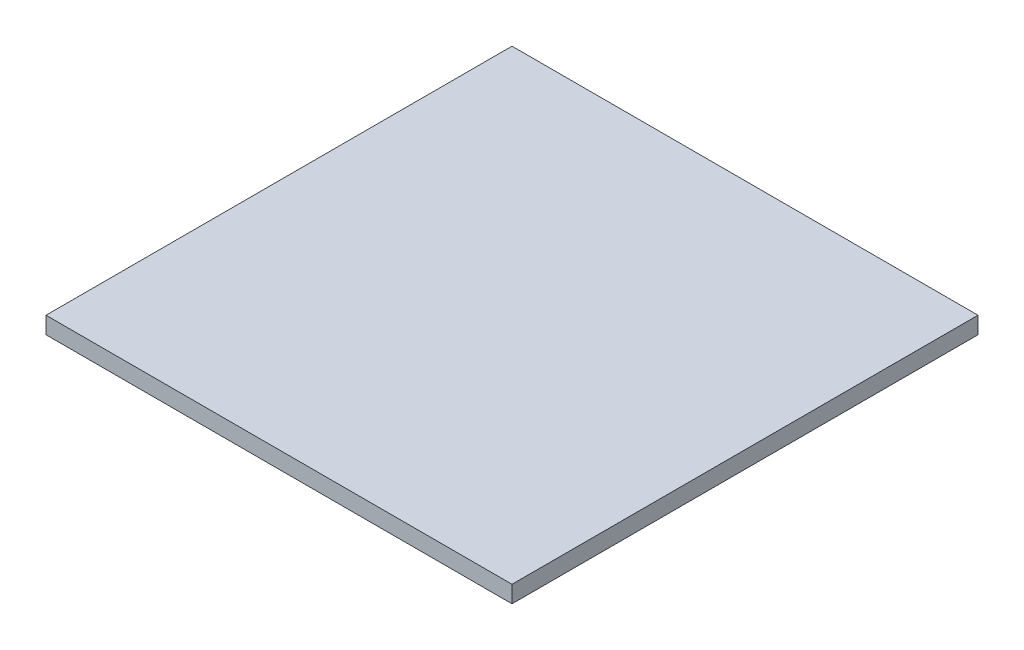
ISO-10303-21;
HEADER;
FILE_DESCRIPTION(('STEP AP214'),'2;1');
FILE_NAME('part.step','',(''),(''),'','','');
FILE_SCHEMA(('AUTOMOTIVE_DESIGN { 1 0 10303 214 1 1 1 1 }'));
ENDSEC;
DATA;
#1=APPLICATION_CONTEXT('core data for automotive mechanical design processes');
#2=APPLICATION_PROTOCOL_DEFINITION('international standard','automotive_design',2000,#1);
#3=PRODUCT_CONTEXT('',#1,'mechanical');
#4=PRODUCT('Part','Part','',(#3));
#5=PRODUCT_RELATED_PRODUCT_CATEGORY('part','',(#4));
#6=PRODUCT_DEFINITION_FORMATION('','',#4);
#7=PRODUCT_DEFINITION_CONTEXT('part definition',#1,'design');
#8=PRODUCT_DEFINITION('design','',#6,#7);
#9=PRODUCT_DEFINITION_SHAPE('','',#8);
#10=(LENGTH_UNIT() NAMED_UNIT(*) SI_UNIT(.MILLI.,.METRE.));
#11=(NAMED_UNIT(*) PLANE_ANGLE_UNIT() SI_UNIT($,.RADIAN.));
#12=(NAMED_UNIT(*) SI_UNIT($,.STERADIAN.) SOLID_ANGLE_UNIT());
#13=UNCERTAINTY_MEASURE_WITH_UNIT(LENGTH_MEASURE(1.E-05),#10,'distance_accuracy_value','');
#14=(GEOMETRIC_REPRESENTATION_CONTEXT(3) GLOBAL_UNCERTAINTY_ASSIGNED_CONTEXT((#13)) GLOBAL_UNIT_ASSIGNED_CONTEXT((#10,
#11,#12)) REPRESENTATION_CONTEXT('',''));
#15=CARTESIAN_POINT('',(0.,0.,0.));
#16=DIRECTION('',(0.,0.,1.));
#17=DIRECTION('',(1.,0.,0.));
#18=AXIS2_PLACEMENT_3D('',#15,#16,#17);
#19=CARTESIAN_POINT('',(275.,20.,-275.));
#20=DIRECTION('',(-1.,0.,0.));
#21=DIRECTION('',(0.,0.,1.));
#22=AXIS2_PLACEMENT_3D('',#19,#20,#21);
#23=PLANE('',#22);
#24=DIRECTION('',(0.,0.,-1.));
#25=VECTOR('',#24,1.);
#26=CARTESIAN_POINT('',(275.,0.,-275.));
#27=LINE('',#26,#25);
#28=CARTESIAN_POINT('',(275.,0.,275.));
#29=VERTEX_POINT('',#28);
#30=CARTESIAN_POINT('',(275.,0.,-275.));
#31=VERTEX_POINT('',#30);
#32=EDGE_CURVE('E106',#29,#31,#27,.T.);
#33=ORIENTED_EDGE('',*,*,#32,.T.);
#34=DIRECTION('',(0.,-1.,0.));
#35=VECTOR('',#34,1.);
#36=CARTESIAN_POINT('',(275.,20.,-275.));
#37=LINE('',#36,#35);
#38=CARTESIAN_POINT('',(275.,20.,-275.));
#39=VERTEX_POINT('',#38);
#40=EDGE_CURVE('E11',#39,#31,#37,.T.);
#41=ORIENTED_EDGE('',*,*,#40,.F.);
#42=DIRECTION('',(0.,0.,-1.));
#43=VECTOR('',#42,1.);
#44=CARTESIAN_POINT('',(275.,20.,-275.));
#45=LINE('',#44,#43);
#46=CARTESIAN_POINT('',(275.,20.,275.));
#47=VERTEX_POINT('',#46);
#48=EDGE_CURVE('E94',#47,#39,#45,.T.);
#49=ORIENTED_EDGE('',*,*,#48,.F.);
#50=DIRECTION('',(0.,-1.,0.));
#51=VECTOR('',#50,1.);
#52=CARTESIAN_POINT('',(275.,20.,275.));
#53=LINE('',#52,#51);
#54=EDGE_CURVE('E102',#47,#29,#53,.T.);
#55=ORIENTED_EDGE('',*,*,#54,.T.);
#56=EDGE_LOOP('',(#33,#41,#49,#55));
#57=FACE_BOUND('',#56,.T.);
#58=ADVANCED_FACE('F43',(#57),#23,.F.);
#59=CARTESIAN_POINT('',(-275.,20.,-275.));
#60=DIRECTION('',(0.,0.,1.));
#61=DIRECTION('',(1.,0.,0.));
#62=AXIS2_PLACEMENT_3D('',#59,#60,#61);
#63=PLANE('',#62);
#64=DIRECTION('',(-1.,0.,0.));
#65=VECTOR('',#64,1.);
#66=CARTESIAN_POINT('',(-275.,0.,-275.));
#67=LINE('',#66,#65);
#68=CARTESIAN_POINT('',(-275.,0.,-275.));
#69=VERTEX_POINT('',#68);
#70=EDGE_CURVE('E98',#31,#69,#67,.T.);
#71=ORIENTED_EDGE('',*,*,#70,.T.);
#72=DIRECTION('',(0.,-1.,0.));
#73=VECTOR('',#72,1.);
#74=CARTESIAN_POINT('',(-275.,20.,-275.));
#75=LINE('',#74,#73);
#76=CARTESIAN_POINT('',(-275.,20.,-275.));
#77=VERTEX_POINT('',#76);
#78=EDGE_CURVE('E51',#77,#69,#75,.T.);
#79=ORIENTED_EDGE('',*,*,#78,.F.);
#80=DIRECTION('',(-1.,0.,0.));
#81=VECTOR('',#80,1.);
#82=CARTESIAN_POINT('',(-275.,20.,-275.));
#83=LINE('',#82,#81);
#84=EDGE_CURVE('E89',#39,#77,#83,.T.);
#85=ORIENTED_EDGE('',*,*,#84,.F.);
#86=ORIENTED_EDGE('',*,*,#40,.T.);
#87=EDGE_LOOP('',(#71,#79,#85,#86));
#88=FACE_BOUND('',#87,.T.);
#89=ADVANCED_FACE('F97',(#88),#63,.F.);
#90=CARTESIAN_POINT('',(-275.,20.,-275.));
#91=DIRECTION('',(1.,0.,0.));
#92=DIRECTION('',(0.,0.,-1.));
#93=AXIS2_PLACEMENT_3D('',#90,#91,#92);
#94=PLANE('',#93);
#95=DIRECTION('',(0.,0.,1.));
#96=VECTOR('',#95,1.);
#97=CARTESIAN_POINT('',(-275.,0.,-275.));
#98=LINE('',#97,#96);
#99=CARTESIAN_POINT('',(-275.,0.,275.));
#100=VERTEX_POINT('',#99);
#101=EDGE_CURVE('E76',#69,#100,#98,.T.);
#102=ORIENTED_EDGE('',*,*,#101,.T.);
#103=DIRECTION('',(0.,-1.,0.));
#104=VECTOR('',#103,1.);
#105=CARTESIAN_POINT('',(-275.,20.,275.));
#106=LINE('',#105,#104);
#107=CARTESIAN_POINT('',(-275.,20.,275.));
#108=VERTEX_POINT('',#107);
#109=EDGE_CURVE('E99',#108,#100,#106,.T.);
#110=ORIENTED_EDGE('',*,*,#109,.F.);
#111=DIRECTION('',(0.,0.,1.));
#112=VECTOR('',#111,1.);
#113=CARTESIAN_POINT('',(-275.,20.,-275.));
#114=LINE('',#113,#112);
#115=EDGE_CURVE('E92',#77,#108,#114,.T.);
#116=ORIENTED_EDGE('',*,*,#115,.F.);
#117=ORIENTED_EDGE('',*,*,#78,.T.);
#118=EDGE_LOOP('',(#102,#110,#116,#117));
#119=FACE_BOUND('',#118,.T.);
#120=ADVANCED_FACE('F100',(#119),#94,.F.);
#121=CARTESIAN_POINT('',(-275.,20.,275.));
#122=DIRECTION('',(0.,0.,-1.));
#123=DIRECTION('',(-1.,0.,0.));
#124=AXIS2_PLACEMENT_3D('',#121,#122,#123);
#125=PLANE('',#124);
#126=DIRECTION('',(1.,0.,0.));
#127=VECTOR('',#126,1.);
#128=CARTESIAN_POINT('',(-275.,0.,275.));
#129=LINE('',#128,#127);
#130=EDGE_CURVE('E82',#100,#29,#129,.T.);
#131=ORIENTED_EDGE('',*,*,#130,.T.);
#132=ORIENTED_EDGE('',*,*,#54,.F.);
#133=DIRECTION('',(1.,0.,0.));
#134=VECTOR('',#133,1.);
#135=CARTESIAN_POINT('',(-275.,20.,275.));
#136=LINE('',#135,#134);
#137=EDGE_CURVE('E59',#108,#47,#136,.T.);
#138=ORIENTED_EDGE('',*,*,#137,.F.);
#139=ORIENTED_EDGE('',*,*,#109,.T.);
#140=EDGE_LOOP('',(#131,#132,#138,#139));
#141=FACE_BOUND('',#140,.T.);
#142=ADVANCED_FACE('F113',(#141),#125,.F.);
#143=CARTESIAN_POINT('',(0.,20.,0.));
#144=DIRECTION('',(0.,1.,0.));
#145=DIRECTION('',(0.,0.,1.));
#146=AXIS2_PLACEMENT_3D('',#143,#144,#145);
#147=PLANE('',#146);
#148=ORIENTED_EDGE('',*,*,#48,.T.);
#149=ORIENTED_EDGE('',*,*,#84,.T.);
#150=ORIENTED_EDGE('',*,*,#115,.T.);
#151=ORIENTED_EDGE('',*,*,#137,.T.);
#152=EDGE_LOOP('',(#148,#149,#150,#151));
#153=FACE_BOUND('',#152,.T.);
#154=ADVANCED_FACE('F90',(#153),#147,.T.);
#155=CARTESIAN_POINT('',(0.,0.,0.));
#156=DIRECTION('',(0.,1.,0.));
#157=DIRECTION('',(0.,0.,1.));
#158=AXIS2_PLACEMENT_3D('',#155,#156,#157);
#159=PLANE('',#158);
#160=ORIENTED_EDGE('',*,*,#32,.F.);
#161=ORIENTED_EDGE('',*,*,#130,.F.);
#162=ORIENTED_EDGE('',*,*,#101,.F.);
#163=ORIENTED_EDGE('',*,*,#70,.F.);
#164=EDGE_LOOP('',(#160,#161,#162,#163));
#165=FACE_BOUND('',#164,.T.);
#166=ADVANCED_FACE('F116',(#165),#159,.F.);
#167=CLOSED_SHELL('',(#58,#89,#120,#142,#154,#166));
#168=MANIFOLD_SOLID_BREP('B2',#167);
#169=ADVANCED_BREP_SHAPE_REPRESENTATION('',(#18,#168),#14);
#170=SHAPE_DEFINITION_REPRESENTATION(#9,#169);
ENDSEC;
END-ISO-10303-21;
